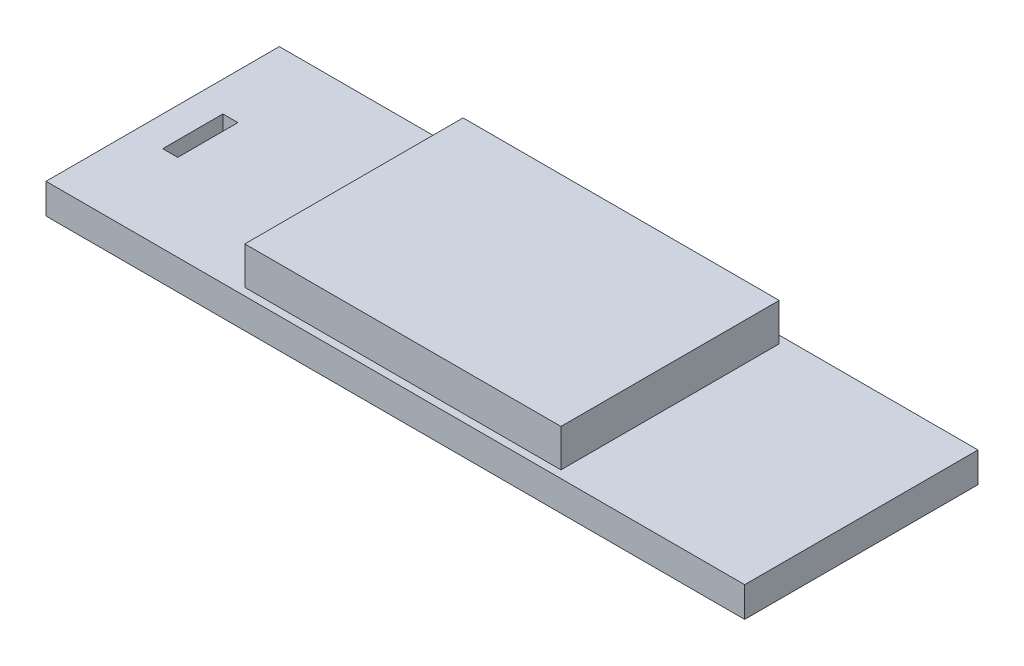
ISO-10303-21;
HEADER;
FILE_DESCRIPTION(('STEP AP214'),'2;1');
FILE_NAME('part.step','',(''),(''),'','','');
FILE_SCHEMA(('AUTOMOTIVE_DESIGN { 1 0 10303 214 1 1 1 1 }'));
ENDSEC;
DATA;
#1=APPLICATION_CONTEXT('core data for automotive mechanical design processes');
#2=APPLICATION_PROTOCOL_DEFINITION('international standard','automotive_design',2000,#1);
#3=PRODUCT_CONTEXT('',#1,'mechanical');
#4=PRODUCT('Part','Part','',(#3));
#5=PRODUCT_RELATED_PRODUCT_CATEGORY('part','',(#4));
#6=PRODUCT_DEFINITION_FORMATION('','',#4);
#7=PRODUCT_DEFINITION_CONTEXT('part definition',#1,'design');
#8=PRODUCT_DEFINITION('design','',#6,#7);
#9=PRODUCT_DEFINITION_SHAPE('','',#8);
#10=(LENGTH_UNIT() NAMED_UNIT(*) SI_UNIT(.MILLI.,.METRE.));
#11=(NAMED_UNIT(*) PLANE_ANGLE_UNIT() SI_UNIT($,.RADIAN.));
#12=(NAMED_UNIT(*) SI_UNIT($,.STERADIAN.) SOLID_ANGLE_UNIT());
#13=UNCERTAINTY_MEASURE_WITH_UNIT(LENGTH_MEASURE(1.E-05),#10,'distance_accuracy_value','');
#14=(GEOMETRIC_REPRESENTATION_CONTEXT(3) GLOBAL_UNCERTAINTY_ASSIGNED_CONTEXT((#13)) GLOBAL_UNIT_ASSIGNED_CONTEXT((#10,
#11,#12)) REPRESENTATION_CONTEXT('',''));
#15=CARTESIAN_POINT('',(0.,0.,0.));
#16=DIRECTION('',(0.,0.,1.));
#17=DIRECTION('',(1.,0.,0.));
#18=AXIS2_PLACEMENT_3D('',#15,#16,#17);
#19=CARTESIAN_POINT('',(0.,4.,0.));
#20=DIRECTION('',(0.,-1.,0.));
#21=DIRECTION('',(0.,0.,-1.));
#22=AXIS2_PLACEMENT_3D('',#19,#20,#21);
#23=PLANE('',#22);
#24=DIRECTION('',(-1.,0.,0.));
#25=VECTOR('',#24,1.);
#26=CARTESIAN_POINT('',(0.,4.,4.));
#27=LINE('',#26,#25);
#28=CARTESIAN_POINT('',(6.,4.,4.));
#29=VERTEX_POINT('',#28);
#30=CARTESIAN_POINT('',(4.,4.,4.));
#31=VERTEX_POINT('',#30);
#32=EDGE_CURVE('E194',#29,#31,#27,.T.);
#33=ORIENTED_EDGE('',*,*,#32,.T.);
#34=DIRECTION('',(0.,0.,-1.));
#35=VECTOR('',#34,1.);
#36=CARTESIAN_POINT('',(4.,4.,0.));
#37=LINE('',#36,#35);
#38=CARTESIAN_POINT('',(4.,4.,-4.));
#39=VERTEX_POINT('',#38);
#40=EDGE_CURVE('E206',#31,#39,#37,.T.);
#41=ORIENTED_EDGE('',*,*,#40,.T.);
#42=DIRECTION('',(1.,0.,0.));
#43=VECTOR('',#42,1.);
#44=CARTESIAN_POINT('',(0.,4.,-4.));
#45=LINE('',#44,#43);
#46=CARTESIAN_POINT('',(6.,4.,-4.));
#47=VERTEX_POINT('',#46);
#48=EDGE_CURVE('E202',#39,#47,#45,.T.);
#49=ORIENTED_EDGE('',*,*,#48,.T.);
#50=DIRECTION('',(0.,0.,1.));
#51=VECTOR('',#50,1.);
#52=CARTESIAN_POINT('',(6.,4.,0.));
#53=LINE('',#52,#51);
#54=EDGE_CURVE('E198',#47,#29,#53,.T.);
#55=ORIENTED_EDGE('',*,*,#54,.T.);
#56=EDGE_LOOP('',(#33,#41,#49,#55));
#57=FACE_BOUND('',#56,.T.);
#58=DIRECTION('',(-1.,0.,0.));
#59=VECTOR('',#58,1.);
#60=CARTESIAN_POINT('',(0.,4.,4.));
#61=LINE('',#60,#59);
#62=CARTESIAN_POINT('',(24.,4.,4.));
#63=VERTEX_POINT('',#62);
#64=CARTESIAN_POINT('',(22.,4.,4.));
#65=VERTEX_POINT('',#64);
#66=EDGE_CURVE('E158',#63,#65,#61,.T.);
#67=ORIENTED_EDGE('',*,*,#66,.T.);
#68=DIRECTION('',(0.,0.,-1.));
#69=VECTOR('',#68,1.);
#70=CARTESIAN_POINT('',(22.,4.,0.));
#71=LINE('',#70,#69);
#72=CARTESIAN_POINT('',(22.,4.,-4.));
#73=VERTEX_POINT('',#72);
#74=EDGE_CURVE('E188',#65,#73,#71,.T.);
#75=ORIENTED_EDGE('',*,*,#74,.T.);
#76=DIRECTION('',(1.,0.,0.));
#77=VECTOR('',#76,1.);
#78=CARTESIAN_POINT('',(0.,4.,-4.));
#79=LINE('',#78,#77);
#80=CARTESIAN_POINT('',(24.,4.,-4.));
#81=VERTEX_POINT('',#80);
#82=EDGE_CURVE('E182',#73,#81,#79,.T.);
#83=ORIENTED_EDGE('',*,*,#82,.T.);
#84=DIRECTION('',(0.,0.,1.));
#85=VECTOR('',#84,1.);
#86=CARTESIAN_POINT('',(24.,4.,0.));
#87=LINE('',#86,#85);
#88=EDGE_CURVE('E167',#81,#63,#87,.T.);
#89=ORIENTED_EDGE('',*,*,#88,.T.);
#90=EDGE_LOOP('',(#67,#75,#83,#89));
#91=FACE_BOUND('',#90,.T.);
#92=DIRECTION('',(0.,0.,1.));
#93=VECTOR('',#92,1.);
#94=CARTESIAN_POINT('',(0.,4.,15.5));
#95=LINE('',#94,#93);
#96=CARTESIAN_POINT('',(0.,4.,-15.5));
#97=VERTEX_POINT('',#96);
#98=CARTESIAN_POINT('',(0.,4.,15.5));
#99=VERTEX_POINT('',#98);
#100=EDGE_CURVE('E264',#97,#99,#95,.T.);
#101=ORIENTED_EDGE('',*,*,#100,.T.);
#102=DIRECTION('',(1.,0.,0.));
#103=VECTOR('',#102,1.);
#104=CARTESIAN_POINT('',(0.,4.,15.5));
#105=LINE('',#104,#103);
#106=CARTESIAN_POINT('',(92.82,4.,15.5));
#107=VERTEX_POINT('',#106);
#108=EDGE_CURVE('E268',#99,#107,#105,.T.);
#109=ORIENTED_EDGE('',*,*,#108,.T.);
#110=DIRECTION('',(0.,0.,-1.));
#111=VECTOR('',#110,1.);
#112=CARTESIAN_POINT('',(92.82,4.,15.5));
#113=LINE('',#112,#111);
#114=CARTESIAN_POINT('',(92.82,4.,-15.5));
#115=VERTEX_POINT('',#114);
#116=EDGE_CURVE('E272',#107,#115,#113,.T.);
#117=ORIENTED_EDGE('',*,*,#116,.T.);
#118=DIRECTION('',(-1.,0.,0.));
#119=VECTOR('',#118,1.);
#120=CARTESIAN_POINT('',(0.,4.,-15.5));
#121=LINE('',#120,#119);
#122=EDGE_CURVE('E274',#115,#97,#121,.T.);
#123=ORIENTED_EDGE('',*,*,#122,.T.);
#124=EDGE_LOOP('',(#101,#109,#117,#123));
#125=FACE_BOUND('',#124,.T.);
#126=DIRECTION('',(0.,0.,1.));
#127=VECTOR('',#126,1.);
#128=CARTESIAN_POINT('',(25.41,4.,14.5));
#129=LINE('',#128,#127);
#130=CARTESIAN_POINT('',(25.41,4.,-14.5));
#131=VERTEX_POINT('',#130);
#132=CARTESIAN_POINT('',(25.41,4.,14.5));
#133=VERTEX_POINT('',#132);
#134=EDGE_CURVE('E215',#131,#133,#129,.T.);
#135=ORIENTED_EDGE('',*,*,#134,.F.);
#136=DIRECTION('',(-1.,0.,0.));
#137=VECTOR('',#136,1.);
#138=CARTESIAN_POINT('',(25.41,4.,-14.5));
#139=LINE('',#138,#137);
#140=CARTESIAN_POINT('',(67.41,4.,-14.5));
#141=VERTEX_POINT('',#140);
#142=EDGE_CURVE('E224',#141,#131,#139,.T.);
#143=ORIENTED_EDGE('',*,*,#142,.F.);
#144=DIRECTION('',(0.,0.,-1.));
#145=VECTOR('',#144,1.);
#146=CARTESIAN_POINT('',(67.41,4.,14.5));
#147=LINE('',#146,#145);
#148=CARTESIAN_POINT('',(67.41,4.,14.5));
#149=VERTEX_POINT('',#148);
#150=EDGE_CURVE('E241',#149,#141,#147,.T.);
#151=ORIENTED_EDGE('',*,*,#150,.F.);
#152=DIRECTION('',(1.,0.,0.));
#153=VECTOR('',#152,1.);
#154=CARTESIAN_POINT('',(25.41,4.,14.5));
#155=LINE('',#154,#153);
#156=EDGE_CURVE('E237',#133,#149,#155,.T.);
#157=ORIENTED_EDGE('',*,*,#156,.F.);
#158=EDGE_LOOP('',(#135,#143,#151,#157));
#159=FACE_BOUND('',#158,.T.);
#160=ADVANCED_FACE('F47',(#57,#91,#125,#159),#23,.F.);
#161=CARTESIAN_POINT('',(0.,4.,15.5));
#162=DIRECTION('',(1.,0.,0.));
#163=DIRECTION('',(0.,0.,-1.));
#164=AXIS2_PLACEMENT_3D('',#161,#162,#163);
#165=PLANE('',#164);
#166=DIRECTION('',(0.,0.,1.));
#167=VECTOR('',#166,1.);
#168=CARTESIAN_POINT('',(0.,0.,15.5));
#169=LINE('',#168,#167);
#170=CARTESIAN_POINT('',(0.,0.,-15.5));
#171=VERTEX_POINT('',#170);
#172=CARTESIAN_POINT('',(0.,0.,15.5));
#173=VERTEX_POINT('',#172);
#174=EDGE_CURVE('E263',#171,#173,#169,.T.);
#175=ORIENTED_EDGE('',*,*,#174,.T.);
#176=DIRECTION('',(0.,-1.,0.));
#177=VECTOR('',#176,1.);
#178=CARTESIAN_POINT('',(0.,4.,15.5));
#179=LINE('',#178,#177);
#180=EDGE_CURVE('E300',#99,#173,#179,.T.);
#181=ORIENTED_EDGE('',*,*,#180,.F.);
#182=ORIENTED_EDGE('',*,*,#100,.F.);
#183=DIRECTION('',(0.,-1.,0.));
#184=VECTOR('',#183,1.);
#185=CARTESIAN_POINT('',(0.,4.,-15.5));
#186=LINE('',#185,#184);
#187=EDGE_CURVE('E277',#97,#171,#186,.T.);
#188=ORIENTED_EDGE('',*,*,#187,.T.);
#189=EDGE_LOOP('',(#175,#181,#182,#188));
#190=FACE_BOUND('',#189,.T.);
#191=ADVANCED_FACE('F49',(#190),#165,.F.);
#192=CARTESIAN_POINT('',(0.,4.,15.5));
#193=DIRECTION('',(0.,0.,-1.));
#194=DIRECTION('',(-1.,0.,0.));
#195=AXIS2_PLACEMENT_3D('',#192,#193,#194);
#196=PLANE('',#195);
#197=DIRECTION('',(1.,0.,0.));
#198=VECTOR('',#197,1.);
#199=CARTESIAN_POINT('',(0.,0.,15.5));
#200=LINE('',#199,#198);
#201=CARTESIAN_POINT('',(92.82,0.,15.5));
#202=VERTEX_POINT('',#201);
#203=EDGE_CURVE('E281',#173,#202,#200,.T.);
#204=ORIENTED_EDGE('',*,*,#203,.T.);
#205=DIRECTION('',(0.,-1.,0.));
#206=VECTOR('',#205,1.);
#207=CARTESIAN_POINT('',(92.82,4.,15.5));
#208=LINE('',#207,#206);
#209=EDGE_CURVE('E296',#107,#202,#208,.T.);
#210=ORIENTED_EDGE('',*,*,#209,.F.);
#211=ORIENTED_EDGE('',*,*,#108,.F.);
#212=ORIENTED_EDGE('',*,*,#180,.T.);
#213=EDGE_LOOP('',(#204,#210,#211,#212));
#214=FACE_BOUND('',#213,.T.);
#215=ADVANCED_FACE('F384',(#214),#196,.F.);
#216=CARTESIAN_POINT('',(92.82,4.,15.5));
#217=DIRECTION('',(-1.,0.,0.));
#218=DIRECTION('',(0.,0.,1.));
#219=AXIS2_PLACEMENT_3D('',#216,#217,#218);
#220=PLANE('',#219);
#221=DIRECTION('',(0.,0.,-1.));
#222=VECTOR('',#221,1.);
#223=CARTESIAN_POINT('',(92.82,0.,15.5));
#224=LINE('',#223,#222);
#225=CARTESIAN_POINT('',(92.82,0.,-15.5));
#226=VERTEX_POINT('',#225);
#227=EDGE_CURVE('E284',#202,#226,#224,.T.);
#228=ORIENTED_EDGE('',*,*,#227,.T.);
#229=DIRECTION('',(0.,-1.,0.));
#230=VECTOR('',#229,1.);
#231=CARTESIAN_POINT('',(92.82,4.,-15.5));
#232=LINE('',#231,#230);
#233=EDGE_CURVE('E292',#115,#226,#232,.T.);
#234=ORIENTED_EDGE('',*,*,#233,.F.);
#235=ORIENTED_EDGE('',*,*,#116,.F.);
#236=ORIENTED_EDGE('',*,*,#209,.T.);
#237=EDGE_LOOP('',(#228,#234,#235,#236));
#238=FACE_BOUND('',#237,.T.);
#239=ADVANCED_FACE('F381',(#238),#220,.F.);
#240=CARTESIAN_POINT('',(0.,4.,-15.5));
#241=DIRECTION('',(0.,0.,1.));
#242=DIRECTION('',(1.,0.,0.));
#243=AXIS2_PLACEMENT_3D('',#240,#241,#242);
#244=PLANE('',#243);
#245=DIRECTION('',(-1.,0.,0.));
#246=VECTOR('',#245,1.);
#247=CARTESIAN_POINT('',(0.,0.,-15.5));
#248=LINE('',#247,#246);
#249=EDGE_CURVE('E269',#226,#171,#248,.T.);
#250=ORIENTED_EDGE('',*,*,#249,.T.);
#251=ORIENTED_EDGE('',*,*,#187,.F.);
#252=ORIENTED_EDGE('',*,*,#122,.F.);
#253=ORIENTED_EDGE('',*,*,#233,.T.);
#254=EDGE_LOOP('',(#250,#251,#252,#253));
#255=FACE_BOUND('',#254,.T.);
#256=ADVANCED_FACE('F365',(#255),#244,.F.);
#257=CARTESIAN_POINT('',(0.,0.,0.));
#258=DIRECTION('',(0.,-1.,0.));
#259=DIRECTION('',(0.,0.,-1.));
#260=AXIS2_PLACEMENT_3D('',#257,#258,#259);
#261=PLANE('',#260);
#262=DIRECTION('',(0.,0.,-1.));
#263=VECTOR('',#262,1.);
#264=CARTESIAN_POINT('',(4.,0.,0.));
#265=LINE('',#264,#263);
#266=CARTESIAN_POINT('',(4.,0.,4.));
#267=VERTEX_POINT('',#266);
#268=CARTESIAN_POINT('',(4.,0.,-4.));
#269=VERTEX_POINT('',#268);
#270=EDGE_CURVE('E11',#267,#269,#265,.T.);
#271=ORIENTED_EDGE('',*,*,#270,.F.);
#272=DIRECTION('',(-1.,0.,0.));
#273=VECTOR('',#272,1.);
#274=CARTESIAN_POINT('',(0.,0.,4.));
#275=LINE('',#274,#273);
#276=CARTESIAN_POINT('',(6.,0.,4.));
#277=VERTEX_POINT('',#276);
#278=EDGE_CURVE('E315',#277,#267,#275,.T.);
#279=ORIENTED_EDGE('',*,*,#278,.F.);
#280=DIRECTION('',(0.,0.,1.));
#281=VECTOR('',#280,1.);
#282=CARTESIAN_POINT('',(6.,0.,0.));
#283=LINE('',#282,#281);
#284=CARTESIAN_POINT('',(6.,0.,-4.));
#285=VERTEX_POINT('',#284);
#286=EDGE_CURVE('E318',#285,#277,#283,.T.);
#287=ORIENTED_EDGE('',*,*,#286,.F.);
#288=DIRECTION('',(1.,0.,0.));
#289=VECTOR('',#288,1.);
#290=CARTESIAN_POINT('',(0.,0.,-4.));
#291=LINE('',#290,#289);
#292=EDGE_CURVE('E56',#269,#285,#291,.T.);
#293=ORIENTED_EDGE('',*,*,#292,.F.);
#294=EDGE_LOOP('',(#271,#279,#287,#293));
#295=FACE_BOUND('',#294,.T.);
#296=DIRECTION('',(0.,0.,-1.));
#297=VECTOR('',#296,1.);
#298=CARTESIAN_POINT('',(22.,0.,0.));
#299=LINE('',#298,#297);
#300=CARTESIAN_POINT('',(22.,0.,4.));
#301=VERTEX_POINT('',#300);
#302=CARTESIAN_POINT('',(22.,0.,-4.));
#303=VERTEX_POINT('',#302);
#304=EDGE_CURVE('E312',#301,#303,#299,.T.);
#305=ORIENTED_EDGE('',*,*,#304,.F.);
#306=DIRECTION('',(-1.,0.,0.));
#307=VECTOR('',#306,1.);
#308=CARTESIAN_POINT('',(0.,0.,4.));
#309=LINE('',#308,#307);
#310=CARTESIAN_POINT('',(24.,0.,4.));
#311=VERTEX_POINT('',#310);
#312=EDGE_CURVE('E304',#311,#301,#309,.T.);
#313=ORIENTED_EDGE('',*,*,#312,.F.);
#314=DIRECTION('',(0.,0.,1.));
#315=VECTOR('',#314,1.);
#316=CARTESIAN_POINT('',(24.,0.,0.));
#317=LINE('',#316,#315);
#318=CARTESIAN_POINT('',(24.,0.,-4.));
#319=VERTEX_POINT('',#318);
#320=EDGE_CURVE('E175',#319,#311,#317,.T.);
#321=ORIENTED_EDGE('',*,*,#320,.F.);
#322=DIRECTION('',(1.,0.,0.));
#323=VECTOR('',#322,1.);
#324=CARTESIAN_POINT('',(0.,0.,-4.));
#325=LINE('',#324,#323);
#326=EDGE_CURVE('E309',#303,#319,#325,.T.);
#327=ORIENTED_EDGE('',*,*,#326,.F.);
#328=EDGE_LOOP('',(#305,#313,#321,#327));
#329=FACE_BOUND('',#328,.T.);
#330=CARTESIAN_POINT('',(46.41,0.,0.));
#331=DIRECTION('',(0.,1.,0.));
#332=DIRECTION('',(0.,0.,1.));
#333=AXIS2_PLACEMENT_3D('',#330,#331,#332);
#334=CIRCLE('',#333,1.8);
#335=CARTESIAN_POINT('',(46.41,0.,1.8));
#336=VERTEX_POINT('',#335);
#337=EDGE_CURVE('E210',#336,#336,#334,.T.);
#338=ORIENTED_EDGE('',*,*,#337,.T.);
#339=EDGE_LOOP('',(#338));
#340=FACE_BOUND('',#339,.T.);
#341=ORIENTED_EDGE('',*,*,#174,.F.);
#342=ORIENTED_EDGE('',*,*,#249,.F.);
#343=ORIENTED_EDGE('',*,*,#227,.F.);
#344=ORIENTED_EDGE('',*,*,#203,.F.);
#345=EDGE_LOOP('',(#341,#342,#343,#344));
#346=FACE_BOUND('',#345,.T.);
#347=ADVANCED_FACE('F340',(#295,#329,#340,#346),#261,.T.);
#348=CARTESIAN_POINT('',(25.41,9.,14.5));
#349=DIRECTION('',(1.,0.,0.));
#350=DIRECTION('',(0.,0.,-1.));
#351=AXIS2_PLACEMENT_3D('',#348,#349,#350);
#352=PLANE('',#351);
#353=ORIENTED_EDGE('',*,*,#134,.T.);
#354=DIRECTION('',(0.,-1.,0.));
#355=VECTOR('',#354,1.);
#356=CARTESIAN_POINT('',(25.41,9.,14.5));
#357=LINE('',#356,#355);
#358=CARTESIAN_POINT('',(25.41,9.,14.5));
#359=VERTEX_POINT('',#358);
#360=EDGE_CURVE('E259',#359,#133,#357,.T.);
#361=ORIENTED_EDGE('',*,*,#360,.F.);
#362=DIRECTION('',(0.,0.,1.));
#363=VECTOR('',#362,1.);
#364=CARTESIAN_POINT('',(25.41,9.,14.5));
#365=LINE('',#364,#363);
#366=CARTESIAN_POINT('',(25.41,9.,-14.5));
#367=VERTEX_POINT('',#366);
#368=EDGE_CURVE('E219',#367,#359,#365,.T.);
#369=ORIENTED_EDGE('',*,*,#368,.F.);
#370=DIRECTION('',(0.,-1.,0.));
#371=VECTOR('',#370,1.);
#372=CARTESIAN_POINT('',(25.41,9.,-14.5));
#373=LINE('',#372,#371);
#374=EDGE_CURVE('E233',#367,#131,#373,.T.);
#375=ORIENTED_EDGE('',*,*,#374,.T.);
#376=EDGE_LOOP('',(#353,#361,#369,#375));
#377=FACE_BOUND('',#376,.T.);
#378=ADVANCED_FACE('F364',(#377),#352,.F.);
#379=CARTESIAN_POINT('',(25.41,9.,14.5));
#380=DIRECTION('',(0.,0.,-1.));
#381=DIRECTION('',(-1.,0.,0.));
#382=AXIS2_PLACEMENT_3D('',#379,#380,#381);
#383=PLANE('',#382);
#384=ORIENTED_EDGE('',*,*,#156,.T.);
#385=DIRECTION('',(0.,-1.,0.));
#386=VECTOR('',#385,1.);
#387=CARTESIAN_POINT('',(67.41,9.,14.5));
#388=LINE('',#387,#386);
#389=CARTESIAN_POINT('',(67.41,9.,14.5));
#390=VERTEX_POINT('',#389);
#391=EDGE_CURVE('E255',#390,#149,#388,.T.);
#392=ORIENTED_EDGE('',*,*,#391,.F.);
#393=DIRECTION('',(1.,0.,0.));
#394=VECTOR('',#393,1.);
#395=CARTESIAN_POINT('',(25.41,9.,14.5));
#396=LINE('',#395,#394);
#397=EDGE_CURVE('E223',#359,#390,#396,.T.);
#398=ORIENTED_EDGE('',*,*,#397,.F.);
#399=ORIENTED_EDGE('',*,*,#360,.T.);
#400=EDGE_LOOP('',(#384,#392,#398,#399));
#401=FACE_BOUND('',#400,.T.);
#402=ADVANCED_FACE('F404',(#401),#383,.F.);
#403=CARTESIAN_POINT('',(67.41,9.,14.5));
#404=DIRECTION('',(-1.,0.,0.));
#405=DIRECTION('',(0.,0.,1.));
#406=AXIS2_PLACEMENT_3D('',#403,#404,#405);
#407=PLANE('',#406);
#408=ORIENTED_EDGE('',*,*,#150,.T.);
#409=DIRECTION('',(0.,-1.,0.));
#410=VECTOR('',#409,1.);
#411=CARTESIAN_POINT('',(67.41,9.,-14.5));
#412=LINE('',#411,#410);
#413=CARTESIAN_POINT('',(67.41,9.,-14.5));
#414=VERTEX_POINT('',#413);
#415=EDGE_CURVE('E251',#414,#141,#412,.T.);
#416=ORIENTED_EDGE('',*,*,#415,.F.);
#417=DIRECTION('',(0.,0.,-1.));
#418=VECTOR('',#417,1.);
#419=CARTESIAN_POINT('',(67.41,9.,14.5));
#420=LINE('',#419,#418);
#421=EDGE_CURVE('E227',#390,#414,#420,.T.);
#422=ORIENTED_EDGE('',*,*,#421,.F.);
#423=ORIENTED_EDGE('',*,*,#391,.T.);
#424=EDGE_LOOP('',(#408,#416,#422,#423));
#425=FACE_BOUND('',#424,.T.);
#426=ADVANCED_FACE('F402',(#425),#407,.F.);
#427=CARTESIAN_POINT('',(25.41,9.,-14.5));
#428=DIRECTION('',(0.,0.,1.));
#429=DIRECTION('',(1.,0.,0.));
#430=AXIS2_PLACEMENT_3D('',#427,#428,#429);
#431=PLANE('',#430);
#432=ORIENTED_EDGE('',*,*,#142,.T.);
#433=ORIENTED_EDGE('',*,*,#374,.F.);
#434=DIRECTION('',(-1.,0.,0.));
#435=VECTOR('',#434,1.);
#436=CARTESIAN_POINT('',(25.41,9.,-14.5));
#437=LINE('',#436,#435);
#438=EDGE_CURVE('E230',#414,#367,#437,.T.);
#439=ORIENTED_EDGE('',*,*,#438,.F.);
#440=ORIENTED_EDGE('',*,*,#415,.T.);
#441=EDGE_LOOP('',(#432,#433,#439,#440));
#442=FACE_BOUND('',#441,.T.);
#443=ADVANCED_FACE('F393',(#442),#431,.F.);
#444=CARTESIAN_POINT('',(0.,9.,0.));
#445=DIRECTION('',(0.,-1.,0.));
#446=DIRECTION('',(0.,0.,-1.));
#447=AXIS2_PLACEMENT_3D('',#444,#445,#446);
#448=PLANE('',#447);
#449=ORIENTED_EDGE('',*,*,#368,.T.);
#450=ORIENTED_EDGE('',*,*,#397,.T.);
#451=ORIENTED_EDGE('',*,*,#421,.T.);
#452=ORIENTED_EDGE('',*,*,#438,.T.);
#453=EDGE_LOOP('',(#449,#450,#451,#452));
#454=FACE_BOUND('',#453,.T.);
#455=ADVANCED_FACE('F398',(#454),#448,.F.);
#456=CARTESIAN_POINT('',(46.41,4.,0.));
#457=DIRECTION('',(0.,-1.,0.));
#458=DIRECTION('',(0.,0.,-1.));
#459=AXIS2_PLACEMENT_3D('',#456,#457,#458);
#460=CYLINDRICAL_SURFACE('',#459,1.8);
#461=CARTESIAN_POINT('',(46.41,4.,0.));
#462=DIRECTION('',(0.,1.,0.));
#463=DIRECTION('',(0.,0.,1.));
#464=AXIS2_PLACEMENT_3D('',#461,#462,#463);
#465=CIRCLE('',#464,1.8);
#466=CARTESIAN_POINT('',(46.41,4.,1.8));
#467=VERTEX_POINT('',#466);
#468=EDGE_CURVE('E211',#467,#467,#465,.T.);
#469=ORIENTED_EDGE('',*,*,#468,.T.);
#470=EDGE_LOOP('',(#469));
#471=FACE_BOUND('',#470,.T.);
#472=ORIENTED_EDGE('',*,*,#337,.F.);
#473=EDGE_LOOP('',(#472));
#474=FACE_BOUND('',#473,.T.);
#475=ADVANCED_FACE('F517',(#471,#474),#460,.F.);
#476=CARTESIAN_POINT('',(46.41,4.,0.));
#477=DIRECTION('',(0.,1.,0.));
#478=DIRECTION('',(0.,0.,1.));
#479=AXIS2_PLACEMENT_3D('',#476,#477,#478);
#480=PLANE('',#479);
#481=ORIENTED_EDGE('',*,*,#468,.F.);
#482=EDGE_LOOP('',(#481));
#483=FACE_BOUND('',#482,.T.);
#484=ADVANCED_FACE('F432',(#483),#480,.F.);
#485=CARTESIAN_POINT('',(22.,-1.2E-05,4.));
#486=DIRECTION('',(-1.,0.,0.));
#487=DIRECTION('',(0.,0.,1.));
#488=AXIS2_PLACEMENT_3D('',#485,#486,#487);
#489=PLANE('',#488);
#490=DIRECTION('',(0.,1.,0.));
#491=VECTOR('',#490,1.);
#492=CARTESIAN_POINT('',(22.,-1.2E-05,4.));
#493=LINE('',#492,#491);
#494=EDGE_CURVE('E71',#301,#65,#493,.T.);
#495=ORIENTED_EDGE('',*,*,#494,.F.);
#496=ORIENTED_EDGE('',*,*,#304,.T.);
#497=DIRECTION('',(0.,1.,0.));
#498=VECTOR('',#497,1.);
#499=CARTESIAN_POINT('',(22.,-1.2E-05,-4.));
#500=LINE('',#499,#498);
#501=EDGE_CURVE('E352',#303,#73,#500,.T.);
#502=ORIENTED_EDGE('',*,*,#501,.T.);
#503=ORIENTED_EDGE('',*,*,#74,.F.);
#504=EDGE_LOOP('',(#495,#496,#502,#503));
#505=FACE_BOUND('',#504,.T.);
#506=ADVANCED_FACE('F357',(#505),#489,.F.);
#507=CARTESIAN_POINT('',(22.,-1.2E-05,-4.));
#508=DIRECTION('',(0.,0.,-1.));
#509=DIRECTION('',(-1.,0.,0.));
#510=AXIS2_PLACEMENT_3D('',#507,#508,#509);
#511=PLANE('',#510);
#512=ORIENTED_EDGE('',*,*,#501,.F.);
#513=ORIENTED_EDGE('',*,*,#326,.T.);
#514=DIRECTION('',(0.,1.,0.));
#515=VECTOR('',#514,1.);
#516=CARTESIAN_POINT('',(24.,-1.2E-05,-4.));
#517=LINE('',#516,#515);
#518=EDGE_CURVE('E178',#319,#81,#517,.T.);
#519=ORIENTED_EDGE('',*,*,#518,.T.);
#520=ORIENTED_EDGE('',*,*,#82,.F.);
#521=EDGE_LOOP('',(#512,#513,#519,#520));
#522=FACE_BOUND('',#521,.T.);
#523=ADVANCED_FACE('F361',(#522),#511,.F.);
#524=CARTESIAN_POINT('',(24.,-1.2E-05,4.));
#525=DIRECTION('',(1.,0.,0.));
#526=DIRECTION('',(0.,0.,-1.));
#527=AXIS2_PLACEMENT_3D('',#524,#525,#526);
#528=PLANE('',#527);
#529=ORIENTED_EDGE('',*,*,#518,.F.);
#530=ORIENTED_EDGE('',*,*,#320,.T.);
#531=DIRECTION('',(0.,1.,0.));
#532=VECTOR('',#531,1.);
#533=CARTESIAN_POINT('',(24.,-1.2E-05,4.));
#534=LINE('',#533,#532);
#535=EDGE_CURVE('E161',#311,#63,#534,.T.);
#536=ORIENTED_EDGE('',*,*,#535,.T.);
#537=ORIENTED_EDGE('',*,*,#88,.F.);
#538=EDGE_LOOP('',(#529,#530,#536,#537));
#539=FACE_BOUND('',#538,.T.);
#540=ADVANCED_FACE('F172',(#539),#528,.F.);
#541=CARTESIAN_POINT('',(22.,-1.2E-05,4.));
#542=DIRECTION('',(0.,0.,1.));
#543=DIRECTION('',(1.,0.,0.));
#544=AXIS2_PLACEMENT_3D('',#541,#542,#543);
#545=PLANE('',#544);
#546=ORIENTED_EDGE('',*,*,#535,.F.);
#547=ORIENTED_EDGE('',*,*,#312,.T.);
#548=ORIENTED_EDGE('',*,*,#494,.T.);
#549=ORIENTED_EDGE('',*,*,#66,.F.);
#550=EDGE_LOOP('',(#546,#547,#548,#549));
#551=FACE_BOUND('',#550,.T.);
#552=ADVANCED_FACE('F160',(#551),#545,.F.);
#553=CARTESIAN_POINT('',(4.,-1.2E-05,4.));
#554=DIRECTION('',(-1.,0.,0.));
#555=DIRECTION('',(0.,0.,1.));
#556=AXIS2_PLACEMENT_3D('',#553,#554,#555);
#557=PLANE('',#556);
#558=DIRECTION('',(0.,1.,0.));
#559=VECTOR('',#558,1.);
#560=CARTESIAN_POINT('',(4.,-1.2E-05,4.));
#561=LINE('',#560,#559);
#562=EDGE_CURVE('E63',#267,#31,#561,.T.);
#563=ORIENTED_EDGE('',*,*,#562,.F.);
#564=ORIENTED_EDGE('',*,*,#270,.T.);
#565=DIRECTION('',(0.,1.,0.));
#566=VECTOR('',#565,1.);
#567=CARTESIAN_POINT('',(4.,-1.2E-05,-4.));
#568=LINE('',#567,#566);
#569=EDGE_CURVE('E168',#269,#39,#568,.T.);
#570=ORIENTED_EDGE('',*,*,#569,.T.);
#571=ORIENTED_EDGE('',*,*,#40,.F.);
#572=EDGE_LOOP('',(#563,#564,#570,#571));
#573=FACE_BOUND('',#572,.T.);
#574=ADVANCED_FACE('F344',(#573),#557,.F.);
#575=CARTESIAN_POINT('',(4.,-1.2E-05,-4.));
#576=DIRECTION('',(0.,0.,-1.));
#577=DIRECTION('',(-1.,0.,0.));
#578=AXIS2_PLACEMENT_3D('',#575,#576,#577);
#579=PLANE('',#578);
#580=ORIENTED_EDGE('',*,*,#569,.F.);
#581=ORIENTED_EDGE('',*,*,#292,.T.);
#582=DIRECTION('',(0.,1.,0.));
#583=VECTOR('',#582,1.);
#584=CARTESIAN_POINT('',(6.,-1.2E-05,-4.));
#585=LINE('',#584,#583);
#586=EDGE_CURVE('E328',#285,#47,#585,.T.);
#587=ORIENTED_EDGE('',*,*,#586,.T.);
#588=ORIENTED_EDGE('',*,*,#48,.F.);
#589=EDGE_LOOP('',(#580,#581,#587,#588));
#590=FACE_BOUND('',#589,.T.);
#591=ADVANCED_FACE('F327',(#590),#579,.F.);
#592=CARTESIAN_POINT('',(6.,-1.2E-05,4.));
#593=DIRECTION('',(1.,0.,0.));
#594=DIRECTION('',(0.,0.,-1.));
#595=AXIS2_PLACEMENT_3D('',#592,#593,#594);
#596=PLANE('',#595);
#597=ORIENTED_EDGE('',*,*,#586,.F.);
#598=ORIENTED_EDGE('',*,*,#286,.T.);
#599=DIRECTION('',(0.,1.,0.));
#600=VECTOR('',#599,1.);
#601=CARTESIAN_POINT('',(6.,-1.2E-05,4.));
#602=LINE('',#601,#600);
#603=EDGE_CURVE('E338',#277,#29,#602,.T.);
#604=ORIENTED_EDGE('',*,*,#603,.T.);
#605=ORIENTED_EDGE('',*,*,#54,.F.);
#606=EDGE_LOOP('',(#597,#598,#604,#605));
#607=FACE_BOUND('',#606,.T.);
#608=ADVANCED_FACE('F334',(#607),#596,.F.);
#609=CARTESIAN_POINT('',(4.,-1.2E-05,4.));
#610=DIRECTION('',(0.,0.,1.));
#611=DIRECTION('',(1.,0.,0.));
#612=AXIS2_PLACEMENT_3D('',#609,#610,#611);
#613=PLANE('',#612);
#614=ORIENTED_EDGE('',*,*,#603,.F.);
#615=ORIENTED_EDGE('',*,*,#278,.T.);
#616=ORIENTED_EDGE('',*,*,#562,.T.);
#617=ORIENTED_EDGE('',*,*,#32,.F.);
#618=EDGE_LOOP('',(#614,#615,#616,#617));
#619=FACE_BOUND('',#618,.T.);
#620=ADVANCED_FACE('F342',(#619),#613,.F.);
#621=CLOSED_SHELL('',(#160,#191,#215,#239,#256,#347,#378,#402,#426,#443,#455,#475,#484,#506,
#523,#540,#552,#574,#591,#608,#620));
#622=MANIFOLD_SOLID_BREP('B2',#621);
#623=ADVANCED_BREP_SHAPE_REPRESENTATION('',(#18,#622),#14);
#624=SHAPE_DEFINITION_REPRESENTATION(#9,#623);
ENDSEC;
END-ISO-10303-21;
